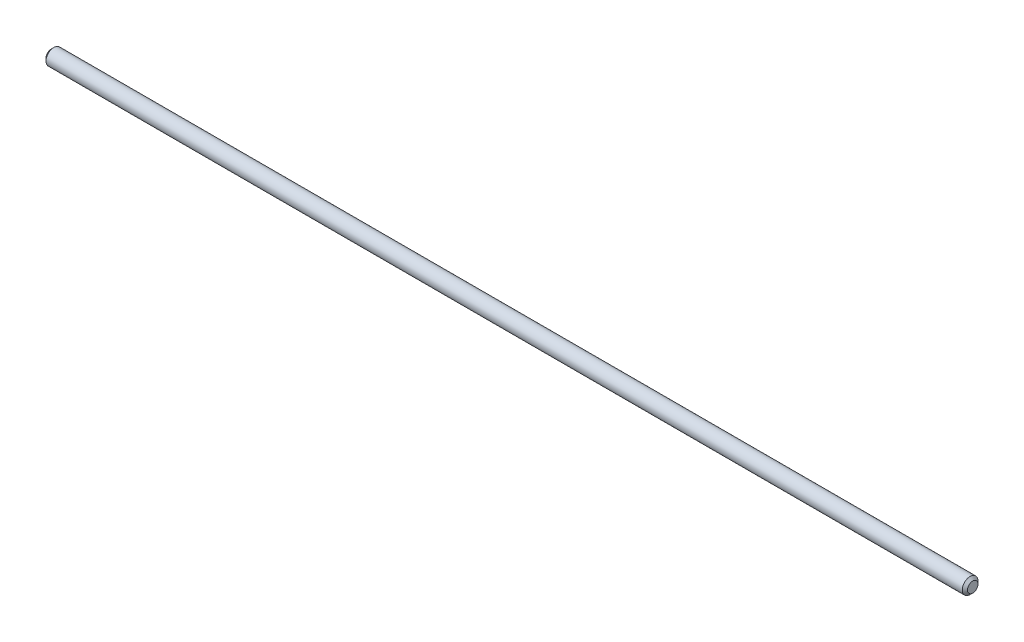
ISO-10303-21;
HEADER;
FILE_DESCRIPTION(('STEP AP214'),'2;1');
FILE_NAME('part.step','',(''),(''),'','','');
FILE_SCHEMA(('AUTOMOTIVE_DESIGN { 1 0 10303 214 1 1 1 1 }'));
ENDSEC;
DATA;
#1=APPLICATION_CONTEXT('core data for automotive mechanical design processes');
#2=APPLICATION_PROTOCOL_DEFINITION('international standard','automotive_design',2000,#1);
#3=PRODUCT_CONTEXT('',#1,'mechanical');
#4=PRODUCT('Part','Part','',(#3));
#5=PRODUCT_RELATED_PRODUCT_CATEGORY('part','',(#4));
#6=PRODUCT_DEFINITION_FORMATION('','',#4);
#7=PRODUCT_DEFINITION_CONTEXT('part definition',#1,'design');
#8=PRODUCT_DEFINITION('design','',#6,#7);
#9=PRODUCT_DEFINITION_SHAPE('','',#8);
#10=(LENGTH_UNIT() NAMED_UNIT(*) SI_UNIT(.MILLI.,.METRE.));
#11=(NAMED_UNIT(*) PLANE_ANGLE_UNIT() SI_UNIT($,.RADIAN.));
#12=(NAMED_UNIT(*) SI_UNIT($,.STERADIAN.) SOLID_ANGLE_UNIT());
#13=UNCERTAINTY_MEASURE_WITH_UNIT(LENGTH_MEASURE(1.E-05),#10,'distance_accuracy_value','');
#14=(GEOMETRIC_REPRESENTATION_CONTEXT(3) GLOBAL_UNCERTAINTY_ASSIGNED_CONTEXT((#13)) GLOBAL_UNIT_ASSIGNED_CONTEXT((#10,
#11,#12)) REPRESENTATION_CONTEXT('',''));
#15=CARTESIAN_POINT('',(0.,0.,0.));
#16=DIRECTION('',(0.,0.,1.));
#17=DIRECTION('',(1.,0.,0.));
#18=AXIS2_PLACEMENT_3D('',#15,#16,#17);
#19=CARTESIAN_POINT('',(175.5,0.,0.));
#20=DIRECTION('',(-1.,0.,0.));
#21=DIRECTION('',(0.,0.,1.));
#22=AXIS2_PLACEMENT_3D('',#19,#20,#21);
#23=CYLINDRICAL_SURFACE('',#22,1.5);
#24=CARTESIAN_POINT('',(0.499999999999973,0.,0.));
#25=DIRECTION('',(1.,0.,0.));
#26=DIRECTION('',(0.,0.,-1.));
#27=AXIS2_PLACEMENT_3D('',#24,#25,#26);
#28=CIRCLE('',#27,1.5);
#29=CARTESIAN_POINT('',(0.499999999999973,0.,-1.5));
#30=VERTEX_POINT('',#29);
#31=EDGE_CURVE('E46',#30,#30,#28,.T.);
#32=ORIENTED_EDGE('',*,*,#31,.T.);
#33=EDGE_LOOP('',(#32));
#34=FACE_BOUND('',#33,.T.);
#35=CARTESIAN_POINT('',(175.,0.,0.));
#36=DIRECTION('',(1.,0.,0.));
#37=DIRECTION('',(0.,0.,-1.));
#38=AXIS2_PLACEMENT_3D('',#35,#36,#37);
#39=CIRCLE('',#38,1.5);
#40=CARTESIAN_POINT('',(175.,0.,-1.5));
#41=VERTEX_POINT('',#40);
#42=EDGE_CURVE('E50',#41,#41,#39,.F.);
#43=ORIENTED_EDGE('',*,*,#42,.T.);
#44=EDGE_LOOP('',(#43));
#45=FACE_BOUND('',#44,.T.);
#46=ADVANCED_FACE('F34',(#34,#45),#23,.T.);
#47=CARTESIAN_POINT('',(175.5,0.,0.));
#48=DIRECTION('',(1.,0.,0.));
#49=DIRECTION('',(0.,0.,-1.));
#50=AXIS2_PLACEMENT_3D('',#47,#48,#49);
#51=PLANE('',#50);
#52=CARTESIAN_POINT('',(175.5,0.,0.));
#53=DIRECTION('',(1.,0.,0.));
#54=DIRECTION('',(0.,0.,-1.));
#55=AXIS2_PLACEMENT_3D('',#52,#53,#54);
#56=CIRCLE('',#55,1.);
#57=CARTESIAN_POINT('',(175.5,0.,-1.));
#58=VERTEX_POINT('',#57);
#59=EDGE_CURVE('E10',#58,#58,#56,.T.);
#60=ORIENTED_EDGE('',*,*,#59,.T.);
#61=EDGE_LOOP('',(#60));
#62=FACE_BOUND('',#61,.T.);
#63=ADVANCED_FACE('F66',(#62),#51,.T.);
#64=CARTESIAN_POINT('',(0.,0.,0.));
#65=DIRECTION('',(1.,0.,0.));
#66=DIRECTION('',(0.,0.,-1.));
#67=AXIS2_PLACEMENT_3D('',#64,#65,#66);
#68=PLANE('',#67);
#69=CARTESIAN_POINT('',(0.,0.,0.));
#70=DIRECTION('',(1.,0.,0.));
#71=DIRECTION('',(0.,0.,-1.));
#72=AXIS2_PLACEMENT_3D('',#69,#70,#71);
#73=CIRCLE('',#72,1.00000000000001);
#74=CARTESIAN_POINT('',(0.,0.,-1.00000000000001));
#75=VERTEX_POINT('',#74);
#76=EDGE_CURVE('E42',#75,#75,#73,.F.);
#77=ORIENTED_EDGE('',*,*,#76,.T.);
#78=EDGE_LOOP('',(#77));
#79=FACE_BOUND('',#78,.T.);
#80=ADVANCED_FACE('F63',(#79),#68,.F.);
#81=CARTESIAN_POINT('',(0.499999999999973,0.,0.));
#82=DIRECTION('',(1.,0.,0.));
#83=DIRECTION('',(0.,0.,-1.));
#84=AXIS2_PLACEMENT_3D('',#81,#82,#83);
#85=CONICAL_SURFACE('',#84,1.5,0.785398163397461);
#86=ORIENTED_EDGE('',*,*,#76,.F.);
#87=EDGE_LOOP('',(#86));
#88=FACE_BOUND('',#87,.T.);
#89=ORIENTED_EDGE('',*,*,#31,.F.);
#90=EDGE_LOOP('',(#89));
#91=FACE_BOUND('',#90,.T.);
#92=ADVANCED_FACE('F59',(#88,#91),#85,.T.);
#93=CARTESIAN_POINT('',(175.5,0.,0.));
#94=DIRECTION('',(-1.,0.,0.));
#95=DIRECTION('',(0.,0.,1.));
#96=AXIS2_PLACEMENT_3D('',#93,#94,#95);
#97=CONICAL_SURFACE('',#96,1.,0.785398163397419);
#98=ORIENTED_EDGE('',*,*,#42,.F.);
#99=EDGE_LOOP('',(#98));
#100=FACE_BOUND('',#99,.T.);
#101=ORIENTED_EDGE('',*,*,#59,.F.);
#102=EDGE_LOOP('',(#101));
#103=FACE_BOUND('',#102,.T.);
#104=ADVANCED_FACE('F37',(#100,#103),#97,.T.);
#105=CLOSED_SHELL('',(#46,#63,#80,#92,#104));
#106=MANIFOLD_SOLID_BREP('B2',#105);
#107=ADVANCED_BREP_SHAPE_REPRESENTATION('',(#18,#106),#14);
#108=SHAPE_DEFINITION_REPRESENTATION(#9,#107);
ENDSEC;
END-ISO-10303-21;
